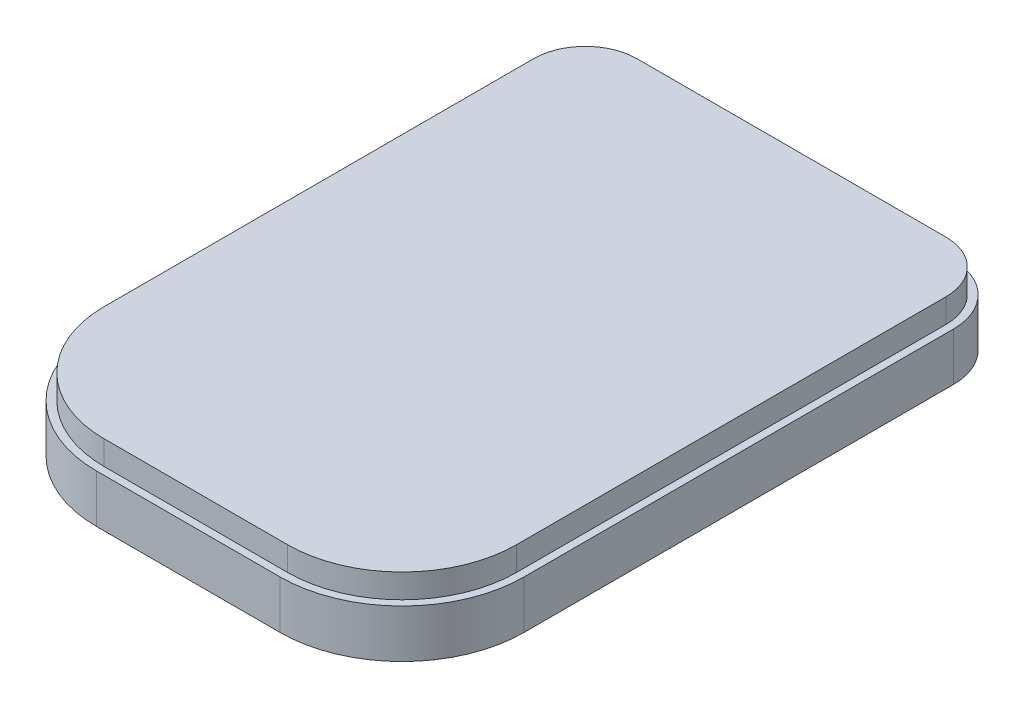
ISO-10303-21;
HEADER;
FILE_DESCRIPTION(('STEP AP214'),'2;1');
FILE_NAME('part.step','',(''),(''),'','','');
FILE_SCHEMA(('AUTOMOTIVE_DESIGN { 1 0 10303 214 1 1 1 1 }'));
ENDSEC;
DATA;
#1=APPLICATION_CONTEXT('core data for automotive mechanical design processes');
#2=APPLICATION_PROTOCOL_DEFINITION('international standard','automotive_design',2000,#1);
#3=PRODUCT_CONTEXT('',#1,'mechanical');
#4=PRODUCT('Part','Part','',(#3));
#5=PRODUCT_RELATED_PRODUCT_CATEGORY('part','',(#4));
#6=PRODUCT_DEFINITION_FORMATION('','',#4);
#7=PRODUCT_DEFINITION_CONTEXT('part definition',#1,'design');
#8=PRODUCT_DEFINITION('design','',#6,#7);
#9=PRODUCT_DEFINITION_SHAPE('','',#8);
#10=(LENGTH_UNIT() NAMED_UNIT(*) SI_UNIT(.MILLI.,.METRE.));
#11=(NAMED_UNIT(*) PLANE_ANGLE_UNIT() SI_UNIT($,.RADIAN.));
#12=(NAMED_UNIT(*) SI_UNIT($,.STERADIAN.) SOLID_ANGLE_UNIT());
#13=UNCERTAINTY_MEASURE_WITH_UNIT(LENGTH_MEASURE(1.E-05),#10,'distance_accuracy_value','');
#14=(GEOMETRIC_REPRESENTATION_CONTEXT(3) GLOBAL_UNCERTAINTY_ASSIGNED_CONTEXT((#13)) GLOBAL_UNIT_ASSIGNED_CONTEXT((#10,
#11,#12)) REPRESENTATION_CONTEXT('',''));
#15=CARTESIAN_POINT('',(0.,0.,0.));
#16=DIRECTION('',(0.,0.,1.));
#17=DIRECTION('',(1.,0.,0.));
#18=AXIS2_PLACEMENT_3D('',#15,#16,#17);
#19=CARTESIAN_POINT('',(32.1126094796714,10.,-51.1626094796714));
#20=DIRECTION('',(0.,-1.,0.));
#21=DIRECTION('',(0.,0.,-1.));
#22=AXIS2_PLACEMENT_3D('',#19,#20,#21);
#23=CYLINDRICAL_SURFACE('',#22,12.3373905203286);
#24=CARTESIAN_POINT('',(32.1126094796714,0.,-51.1626094796714));
#25=DIRECTION('',(0.,1.,0.));
#26=DIRECTION('',(0.,0.,1.));
#27=AXIS2_PLACEMENT_3D('',#24,#25,#26);
#28=CIRCLE('',#27,12.3373905203286);
#29=CARTESIAN_POINT('',(44.45,0.,-51.1626094796714));
#30=VERTEX_POINT('',#29);
#31=CARTESIAN_POINT('',(32.1126094796714,0.,-63.5));
#32=VERTEX_POINT('',#31);
#33=EDGE_CURVE('E175',#30,#32,#28,.T.);
#34=ORIENTED_EDGE('',*,*,#33,.T.);
#35=DIRECTION('',(0.,-1.,0.));
#36=VECTOR('',#35,1.);
#37=CARTESIAN_POINT('',(32.1126094796714,10.,-63.5));
#38=LINE('',#37,#36);
#39=CARTESIAN_POINT('',(32.1126094796714,10.,-63.5));
#40=VERTEX_POINT('',#39);
#41=EDGE_CURVE('E11',#40,#32,#38,.T.);
#42=ORIENTED_EDGE('',*,*,#41,.F.);
#43=CARTESIAN_POINT('',(32.1126094796714,10.,-51.1626094796714));
#44=DIRECTION('',(0.,1.,0.));
#45=DIRECTION('',(0.,0.,1.));
#46=AXIS2_PLACEMENT_3D('',#43,#44,#45);
#47=CIRCLE('',#46,12.3373905203286);
#48=CARTESIAN_POINT('',(44.45,10.,-51.1626094796714));
#49=VERTEX_POINT('',#48);
#50=EDGE_CURVE('E186',#49,#40,#47,.T.);
#51=ORIENTED_EDGE('',*,*,#50,.F.);
#52=DIRECTION('',(0.,-1.,0.));
#53=VECTOR('',#52,1.);
#54=CARTESIAN_POINT('',(44.45,10.,-51.1626094796714));
#55=LINE('',#54,#53);
#56=EDGE_CURVE('E211',#49,#30,#55,.T.);
#57=ORIENTED_EDGE('',*,*,#56,.T.);
#58=EDGE_LOOP('',(#34,#42,#51,#57));
#59=FACE_BOUND('',#58,.T.);
#60=ADVANCED_FACE('F39',(#59),#23,.T.);
#61=CARTESIAN_POINT('',(32.1126094796714,10.,-63.5));
#62=DIRECTION('',(0.,0.,1.));
#63=DIRECTION('',(1.,0.,0.));
#64=AXIS2_PLACEMENT_3D('',#61,#62,#63);
#65=PLANE('',#64);
#66=DIRECTION('',(-1.,0.,0.));
#67=VECTOR('',#66,1.);
#68=CARTESIAN_POINT('',(32.1126094796714,0.,-63.5));
#69=LINE('',#68,#67);
#70=CARTESIAN_POINT('',(-32.1126094796714,0.,-63.5));
#71=VERTEX_POINT('',#70);
#72=EDGE_CURVE('E180',#32,#71,#69,.T.);
#73=ORIENTED_EDGE('',*,*,#72,.T.);
#74=DIRECTION('',(0.,-1.,0.));
#75=VECTOR('',#74,1.);
#76=CARTESIAN_POINT('',(-32.1126094796714,10.,-63.5));
#77=LINE('',#76,#75);
#78=CARTESIAN_POINT('',(-32.1126094796714,10.,-63.5));
#79=VERTEX_POINT('',#78);
#80=EDGE_CURVE('E47',#79,#71,#77,.T.);
#81=ORIENTED_EDGE('',*,*,#80,.F.);
#82=DIRECTION('',(-1.,0.,0.));
#83=VECTOR('',#82,1.);
#84=CARTESIAN_POINT('',(32.1126094796714,10.,-63.5));
#85=LINE('',#84,#83);
#86=EDGE_CURVE('E190',#40,#79,#85,.T.);
#87=ORIENTED_EDGE('',*,*,#86,.F.);
#88=ORIENTED_EDGE('',*,*,#41,.T.);
#89=EDGE_LOOP('',(#73,#81,#87,#88));
#90=FACE_BOUND('',#89,.T.);
#91=ADVANCED_FACE('F283',(#90),#65,.F.);
#92=CARTESIAN_POINT('',(-32.1126094796714,10.,-51.1626094796714));
#93=DIRECTION('',(0.,-1.,0.));
#94=DIRECTION('',(0.,0.,-1.));
#95=AXIS2_PLACEMENT_3D('',#92,#93,#94);
#96=CYLINDRICAL_SURFACE('',#95,12.3373905203286);
#97=CARTESIAN_POINT('',(-32.1126094796714,0.,-51.1626094796714));
#98=DIRECTION('',(0.,1.,0.));
#99=DIRECTION('',(0.,0.,1.));
#100=AXIS2_PLACEMENT_3D('',#97,#98,#99);
#101=CIRCLE('',#100,12.3373905203286);
#102=CARTESIAN_POINT('',(-44.45,0.,-51.1626094796714));
#103=VERTEX_POINT('',#102);
#104=EDGE_CURVE('E215',#71,#103,#101,.T.);
#105=ORIENTED_EDGE('',*,*,#104,.T.);
#106=DIRECTION('',(0.,-1.,0.));
#107=VECTOR('',#106,1.);
#108=CARTESIAN_POINT('',(-44.45,10.,-51.1626094796714));
#109=LINE('',#108,#107);
#110=CARTESIAN_POINT('',(-44.45,10.,-51.1626094796714));
#111=VERTEX_POINT('',#110);
#112=EDGE_CURVE('E251',#111,#103,#109,.T.);
#113=ORIENTED_EDGE('',*,*,#112,.F.);
#114=CARTESIAN_POINT('',(-32.1126094796714,10.,-51.1626094796714));
#115=DIRECTION('',(0.,1.,0.));
#116=DIRECTION('',(0.,0.,1.));
#117=AXIS2_PLACEMENT_3D('',#114,#115,#116);
#118=CIRCLE('',#117,12.3373905203286);
#119=EDGE_CURVE('E194',#79,#111,#118,.T.);
#120=ORIENTED_EDGE('',*,*,#119,.F.);
#121=ORIENTED_EDGE('',*,*,#80,.T.);
#122=EDGE_LOOP('',(#105,#113,#120,#121));
#123=FACE_BOUND('',#122,.T.);
#124=ADVANCED_FACE('F260',(#123),#96,.T.);
#125=CARTESIAN_POINT('',(-44.45,10.,-51.1626094796714));
#126=DIRECTION('',(1.,0.,0.));
#127=DIRECTION('',(0.,0.,-1.));
#128=AXIS2_PLACEMENT_3D('',#125,#126,#127);
#129=PLANE('',#128);
#130=DIRECTION('',(0.,0.,1.));
#131=VECTOR('',#130,1.);
#132=CARTESIAN_POINT('',(-44.45,0.,-51.1626094796714));
#133=LINE('',#132,#131);
#134=CARTESIAN_POINT('',(-44.45,0.,38.1));
#135=VERTEX_POINT('',#134);
#136=EDGE_CURVE('E218',#103,#135,#133,.T.);
#137=ORIENTED_EDGE('',*,*,#136,.T.);
#138=DIRECTION('',(0.,-1.,0.));
#139=VECTOR('',#138,1.);
#140=CARTESIAN_POINT('',(-44.45,10.,38.1));
#141=LINE('',#140,#139);
#142=CARTESIAN_POINT('',(-44.45,10.,38.1));
#143=VERTEX_POINT('',#142);
#144=EDGE_CURVE('E247',#143,#135,#141,.T.);
#145=ORIENTED_EDGE('',*,*,#144,.F.);
#146=DIRECTION('',(0.,0.,1.));
#147=VECTOR('',#146,1.);
#148=CARTESIAN_POINT('',(-44.45,10.,-51.1626094796714));
#149=LINE('',#148,#147);
#150=EDGE_CURVE('E197',#111,#143,#149,.T.);
#151=ORIENTED_EDGE('',*,*,#150,.F.);
#152=ORIENTED_EDGE('',*,*,#112,.T.);
#153=EDGE_LOOP('',(#137,#145,#151,#152));
#154=FACE_BOUND('',#153,.T.);
#155=ADVANCED_FACE('F271',(#154),#129,.F.);
#156=CARTESIAN_POINT('',(-19.05,10.,38.1));
#157=DIRECTION('',(0.,-1.,0.));
#158=DIRECTION('',(0.,0.,-1.));
#159=AXIS2_PLACEMENT_3D('',#156,#157,#158);
#160=CYLINDRICAL_SURFACE('',#159,25.4);
#161=CARTESIAN_POINT('',(-19.05,0.,38.1));
#162=DIRECTION('',(0.,1.,0.));
#163=DIRECTION('',(0.,0.,1.));
#164=AXIS2_PLACEMENT_3D('',#161,#162,#163);
#165=CIRCLE('',#164,25.4);
#166=CARTESIAN_POINT('',(-19.05,0.,63.5));
#167=VERTEX_POINT('',#166);
#168=EDGE_CURVE('E221',#135,#167,#165,.T.);
#169=ORIENTED_EDGE('',*,*,#168,.T.);
#170=DIRECTION('',(0.,-1.,0.));
#171=VECTOR('',#170,1.);
#172=CARTESIAN_POINT('',(-19.05,10.,63.5));
#173=LINE('',#172,#171);
#174=CARTESIAN_POINT('',(-19.05,10.,63.5));
#175=VERTEX_POINT('',#174);
#176=EDGE_CURVE('E243',#175,#167,#173,.T.);
#177=ORIENTED_EDGE('',*,*,#176,.F.);
#178=CARTESIAN_POINT('',(-19.05,10.,38.1));
#179=DIRECTION('',(0.,1.,0.));
#180=DIRECTION('',(0.,0.,1.));
#181=AXIS2_PLACEMENT_3D('',#178,#179,#180);
#182=CIRCLE('',#181,25.4);
#183=EDGE_CURVE('E200',#143,#175,#182,.T.);
#184=ORIENTED_EDGE('',*,*,#183,.F.);
#185=ORIENTED_EDGE('',*,*,#144,.T.);
#186=EDGE_LOOP('',(#169,#177,#184,#185));
#187=FACE_BOUND('',#186,.T.);
#188=ADVANCED_FACE('F275',(#187),#160,.T.);
#189=CARTESIAN_POINT('',(-19.05,10.,63.5));
#190=DIRECTION('',(0.,0.,-1.));
#191=DIRECTION('',(-1.,0.,0.));
#192=AXIS2_PLACEMENT_3D('',#189,#190,#191);
#193=PLANE('',#192);
#194=DIRECTION('',(1.,0.,0.));
#195=VECTOR('',#194,1.);
#196=CARTESIAN_POINT('',(-19.05,0.,63.5));
#197=LINE('',#196,#195);
#198=CARTESIAN_POINT('',(19.05,0.,63.5));
#199=VERTEX_POINT('',#198);
#200=EDGE_CURVE('E224',#167,#199,#197,.T.);
#201=ORIENTED_EDGE('',*,*,#200,.T.);
#202=DIRECTION('',(0.,-1.,0.));
#203=VECTOR('',#202,1.);
#204=CARTESIAN_POINT('',(19.05,10.,63.5));
#205=LINE('',#204,#203);
#206=CARTESIAN_POINT('',(19.05,10.,63.5));
#207=VERTEX_POINT('',#206);
#208=EDGE_CURVE('E239',#207,#199,#205,.T.);
#209=ORIENTED_EDGE('',*,*,#208,.F.);
#210=DIRECTION('',(1.,0.,0.));
#211=VECTOR('',#210,1.);
#212=CARTESIAN_POINT('',(-19.05,10.,63.5));
#213=LINE('',#212,#211);
#214=EDGE_CURVE('E203',#175,#207,#213,.T.);
#215=ORIENTED_EDGE('',*,*,#214,.F.);
#216=ORIENTED_EDGE('',*,*,#176,.T.);
#217=EDGE_LOOP('',(#201,#209,#215,#216));
#218=FACE_BOUND('',#217,.T.);
#219=ADVANCED_FACE('F296',(#218),#193,.F.);
#220=CARTESIAN_POINT('',(19.05,10.,38.1));
#221=DIRECTION('',(0.,-1.,0.));
#222=DIRECTION('',(0.,0.,-1.));
#223=AXIS2_PLACEMENT_3D('',#220,#221,#222);
#224=CYLINDRICAL_SURFACE('',#223,25.4);
#225=CARTESIAN_POINT('',(19.05,0.,38.1));
#226=DIRECTION('',(0.,1.,0.));
#227=DIRECTION('',(0.,0.,1.));
#228=AXIS2_PLACEMENT_3D('',#225,#226,#227);
#229=CIRCLE('',#228,25.4);
#230=CARTESIAN_POINT('',(44.45,0.,38.1));
#231=VERTEX_POINT('',#230);
#232=EDGE_CURVE('E227',#199,#231,#229,.T.);
#233=ORIENTED_EDGE('',*,*,#232,.T.);
#234=DIRECTION('',(0.,-1.,0.));
#235=VECTOR('',#234,1.);
#236=CARTESIAN_POINT('',(44.45,10.,38.1));
#237=LINE('',#236,#235);
#238=CARTESIAN_POINT('',(44.45,10.,38.1));
#239=VERTEX_POINT('',#238);
#240=EDGE_CURVE('E235',#239,#231,#237,.T.);
#241=ORIENTED_EDGE('',*,*,#240,.F.);
#242=CARTESIAN_POINT('',(19.05,10.,38.1));
#243=DIRECTION('',(0.,1.,0.));
#244=DIRECTION('',(0.,0.,1.));
#245=AXIS2_PLACEMENT_3D('',#242,#243,#244);
#246=CIRCLE('',#245,25.4);
#247=EDGE_CURVE('E206',#207,#239,#246,.T.);
#248=ORIENTED_EDGE('',*,*,#247,.F.);
#249=ORIENTED_EDGE('',*,*,#208,.T.);
#250=EDGE_LOOP('',(#233,#241,#248,#249));
#251=FACE_BOUND('',#250,.T.);
#252=ADVANCED_FACE('F294',(#251),#224,.T.);
#253=CARTESIAN_POINT('',(44.45,10.,-51.1626094796714));
#254=DIRECTION('',(-1.,0.,0.));
#255=DIRECTION('',(0.,0.,1.));
#256=AXIS2_PLACEMENT_3D('',#253,#254,#255);
#257=PLANE('',#256);
#258=DIRECTION('',(0.,0.,-1.));
#259=VECTOR('',#258,1.);
#260=CARTESIAN_POINT('',(44.45,0.,-51.1626094796714));
#261=LINE('',#260,#259);
#262=EDGE_CURVE('E191',#231,#30,#261,.T.);
#263=ORIENTED_EDGE('',*,*,#262,.T.);
#264=ORIENTED_EDGE('',*,*,#56,.F.);
#265=DIRECTION('',(0.,0.,-1.));
#266=VECTOR('',#265,1.);
#267=CARTESIAN_POINT('',(44.45,10.,-51.1626094796714));
#268=LINE('',#267,#266);
#269=EDGE_CURVE('E209',#239,#49,#268,.T.);
#270=ORIENTED_EDGE('',*,*,#269,.F.);
#271=ORIENTED_EDGE('',*,*,#240,.T.);
#272=EDGE_LOOP('',(#263,#264,#270,#271));
#273=FACE_BOUND('',#272,.T.);
#274=ADVANCED_FACE('F289',(#273),#257,.F.);
#275=CARTESIAN_POINT('',(32.1126094796714,10.,-51.1626094796714));
#276=DIRECTION('',(0.,1.,0.));
#277=DIRECTION('',(0.,0.,1.));
#278=AXIS2_PLACEMENT_3D('',#275,#276,#277);
#279=PLANE('',#278);
#280=CARTESIAN_POINT('',(-32.1126094796714,10.,-51.1626094796714));
#281=DIRECTION('',(0.,1.,0.));
#282=DIRECTION('',(0.,0.,1.));
#283=AXIS2_PLACEMENT_3D('',#280,#281,#282);
#284=CIRCLE('',#283,10.7498905203286);
#285=CARTESIAN_POINT('',(-32.1126094796714,10.,-61.9125));
#286=VERTEX_POINT('',#285);
#287=CARTESIAN_POINT('',(-42.8625,10.,-51.1626094796714));
#288=VERTEX_POINT('',#287);
#289=EDGE_CURVE('E54',#286,#288,#284,.T.);
#290=ORIENTED_EDGE('',*,*,#289,.F.);
#291=DIRECTION('',(-1.,0.,0.));
#292=VECTOR('',#291,1.);
#293=CARTESIAN_POINT('',(32.1126094796714,10.,-61.9125));
#294=LINE('',#293,#292);
#295=CARTESIAN_POINT('',(32.1126094796714,10.,-61.9125));
#296=VERTEX_POINT('',#295);
#297=EDGE_CURVE('E58',#296,#286,#294,.T.);
#298=ORIENTED_EDGE('',*,*,#297,.F.);
#299=CARTESIAN_POINT('',(32.1126094796714,10.,-51.1626094796714));
#300=DIRECTION('',(0.,1.,0.));
#301=DIRECTION('',(0.,0.,1.));
#302=AXIS2_PLACEMENT_3D('',#299,#300,#301);
#303=CIRCLE('',#302,10.7498905203286);
#304=CARTESIAN_POINT('',(42.8625,10.,-51.1626094796714));
#305=VERTEX_POINT('',#304);
#306=EDGE_CURVE('E450',#305,#296,#303,.T.);
#307=ORIENTED_EDGE('',*,*,#306,.F.);
#308=DIRECTION('',(0.,0.,-1.));
#309=VECTOR('',#308,1.);
#310=CARTESIAN_POINT('',(42.8625,10.,38.1));
#311=LINE('',#310,#309);
#312=CARTESIAN_POINT('',(42.8625,10.,38.1));
#313=VERTEX_POINT('',#312);
#314=EDGE_CURVE('E495',#313,#305,#311,.T.);
#315=ORIENTED_EDGE('',*,*,#314,.F.);
#316=CARTESIAN_POINT('',(19.05,10.,38.1));
#317=DIRECTION('',(0.,1.,0.));
#318=DIRECTION('',(0.,0.,1.));
#319=AXIS2_PLACEMENT_3D('',#316,#317,#318);
#320=CIRCLE('',#319,23.8125);
#321=CARTESIAN_POINT('',(19.05,10.,61.9125));
#322=VERTEX_POINT('',#321);
#323=EDGE_CURVE('E487',#322,#313,#320,.T.);
#324=ORIENTED_EDGE('',*,*,#323,.F.);
#325=DIRECTION('',(1.,0.,0.));
#326=VECTOR('',#325,1.);
#327=CARTESIAN_POINT('',(-19.05,10.,61.9125));
#328=LINE('',#327,#326);
#329=CARTESIAN_POINT('',(-19.05,10.,61.9125));
#330=VERTEX_POINT('',#329);
#331=EDGE_CURVE('E478',#330,#322,#328,.T.);
#332=ORIENTED_EDGE('',*,*,#331,.F.);
#333=CARTESIAN_POINT('',(-19.05,10.,38.1));
#334=DIRECTION('',(0.,1.,0.));
#335=DIRECTION('',(0.,0.,1.));
#336=AXIS2_PLACEMENT_3D('',#333,#334,#335);
#337=CIRCLE('',#336,23.8125);
#338=CARTESIAN_POINT('',(-42.8625,10.,38.1));
#339=VERTEX_POINT('',#338);
#340=EDGE_CURVE('E481',#339,#330,#337,.T.);
#341=ORIENTED_EDGE('',*,*,#340,.F.);
#342=DIRECTION('',(0.,0.,1.));
#343=VECTOR('',#342,1.);
#344=CARTESIAN_POINT('',(-42.8625,10.,-51.1626094796714));
#345=LINE('',#344,#343);
#346=EDGE_CURVE('E483',#288,#339,#345,.T.);
#347=ORIENTED_EDGE('',*,*,#346,.F.);
#348=EDGE_LOOP('',(#290,#298,#307,#315,#324,#332,#341,#347));
#349=FACE_BOUND('',#348,.T.);
#350=ORIENTED_EDGE('',*,*,#50,.T.);
#351=ORIENTED_EDGE('',*,*,#86,.T.);
#352=ORIENTED_EDGE('',*,*,#119,.T.);
#353=ORIENTED_EDGE('',*,*,#150,.T.);
#354=ORIENTED_EDGE('',*,*,#183,.T.);
#355=ORIENTED_EDGE('',*,*,#214,.T.);
#356=ORIENTED_EDGE('',*,*,#247,.T.);
#357=ORIENTED_EDGE('',*,*,#269,.T.);
#358=EDGE_LOOP('',(#350,#351,#352,#353,#354,#355,#356,#357));
#359=FACE_BOUND('',#358,.T.);
#360=ADVANCED_FACE('F279',(#349,#359),#279,.T.);
#361=CARTESIAN_POINT('',(32.1126094796714,0.,-51.1626094796714));
#362=DIRECTION('',(0.,1.,0.));
#363=DIRECTION('',(0.,0.,1.));
#364=AXIS2_PLACEMENT_3D('',#361,#362,#363);
#365=PLANE('',#364);
#366=ORIENTED_EDGE('',*,*,#33,.F.);
#367=ORIENTED_EDGE('',*,*,#262,.F.);
#368=ORIENTED_EDGE('',*,*,#232,.F.);
#369=ORIENTED_EDGE('',*,*,#200,.F.);
#370=ORIENTED_EDGE('',*,*,#168,.F.);
#371=ORIENTED_EDGE('',*,*,#136,.F.);
#372=ORIENTED_EDGE('',*,*,#104,.F.);
#373=ORIENTED_EDGE('',*,*,#72,.F.);
#374=EDGE_LOOP('',(#366,#367,#368,#369,#370,#371,#372,#373));
#375=FACE_BOUND('',#374,.T.);
#376=ADVANCED_FACE('F266',(#375),#365,.F.);
#377=CARTESIAN_POINT('',(-32.1126094796714,15.,-51.1626094796714));
#378=DIRECTION('',(0.,-1.,0.));
#379=DIRECTION('',(0.,0.,-1.));
#380=AXIS2_PLACEMENT_3D('',#377,#378,#379);
#381=CYLINDRICAL_SURFACE('',#380,10.7498905203286);
#382=ORIENTED_EDGE('',*,*,#289,.T.);
#383=DIRECTION('',(0.,-1.,0.));
#384=VECTOR('',#383,1.);
#385=CARTESIAN_POINT('',(-42.8625,15.,-51.1626094796714));
#386=LINE('',#385,#384);
#387=CARTESIAN_POINT('',(-42.8625,15.,-51.1626094796714));
#388=VERTEX_POINT('',#387);
#389=EDGE_CURVE('E155',#388,#288,#386,.T.);
#390=ORIENTED_EDGE('',*,*,#389,.F.);
#391=CARTESIAN_POINT('',(-32.1126094796714,15.,-51.1626094796714));
#392=DIRECTION('',(0.,1.,0.));
#393=DIRECTION('',(0.,0.,1.));
#394=AXIS2_PLACEMENT_3D('',#391,#392,#393);
#395=CIRCLE('',#394,10.7498905203286);
#396=CARTESIAN_POINT('',(-32.1126094796714,15.,-61.9125));
#397=VERTEX_POINT('',#396);
#398=EDGE_CURVE('E162',#397,#388,#395,.T.);
#399=ORIENTED_EDGE('',*,*,#398,.F.);
#400=DIRECTION('',(0.,-1.,0.));
#401=VECTOR('',#400,1.);
#402=CARTESIAN_POINT('',(-32.1126094796714,15.,-61.9125));
#403=LINE('',#402,#401);
#404=EDGE_CURVE('E446',#397,#286,#403,.T.);
#405=ORIENTED_EDGE('',*,*,#404,.T.);
#406=EDGE_LOOP('',(#382,#390,#399,#405));
#407=FACE_BOUND('',#406,.T.);
#408=ADVANCED_FACE('F173',(#407),#381,.T.);
#409=CARTESIAN_POINT('',(-42.8625,15.,-51.1626094796714));
#410=DIRECTION('',(1.,0.,0.));
#411=DIRECTION('',(0.,0.,-1.));
#412=AXIS2_PLACEMENT_3D('',#409,#410,#411);
#413=PLANE('',#412);
#414=ORIENTED_EDGE('',*,*,#346,.T.);
#415=DIRECTION('',(0.,-1.,0.));
#416=VECTOR('',#415,1.);
#417=CARTESIAN_POINT('',(-42.8625,15.,38.1));
#418=LINE('',#417,#416);
#419=CARTESIAN_POINT('',(-42.8625,15.,38.1));
#420=VERTEX_POINT('',#419);
#421=EDGE_CURVE('E157',#420,#339,#418,.T.);
#422=ORIENTED_EDGE('',*,*,#421,.F.);
#423=DIRECTION('',(0.,0.,1.));
#424=VECTOR('',#423,1.);
#425=CARTESIAN_POINT('',(-42.8625,15.,-51.1626094796714));
#426=LINE('',#425,#424);
#427=EDGE_CURVE('E150',#388,#420,#426,.T.);
#428=ORIENTED_EDGE('',*,*,#427,.F.);
#429=ORIENTED_EDGE('',*,*,#389,.T.);
#430=EDGE_LOOP('',(#414,#422,#428,#429));
#431=FACE_BOUND('',#430,.T.);
#432=ADVANCED_FACE('F153',(#431),#413,.F.);
#433=CARTESIAN_POINT('',(-19.05,15.,38.1));
#434=DIRECTION('',(0.,-1.,0.));
#435=DIRECTION('',(0.,0.,-1.));
#436=AXIS2_PLACEMENT_3D('',#433,#434,#435);
#437=CYLINDRICAL_SURFACE('',#436,23.8125);
#438=ORIENTED_EDGE('',*,*,#340,.T.);
#439=DIRECTION('',(0.,-1.,0.));
#440=VECTOR('',#439,1.);
#441=CARTESIAN_POINT('',(-19.05,15.,61.9125));
#442=LINE('',#441,#440);
#443=CARTESIAN_POINT('',(-19.05,15.,61.9125));
#444=VERTEX_POINT('',#443);
#445=EDGE_CURVE('E182',#444,#330,#442,.T.);
#446=ORIENTED_EDGE('',*,*,#445,.F.);
#447=CARTESIAN_POINT('',(-19.05,15.,38.1));
#448=DIRECTION('',(0.,1.,0.));
#449=DIRECTION('',(0.,0.,1.));
#450=AXIS2_PLACEMENT_3D('',#447,#448,#449);
#451=CIRCLE('',#450,23.8125);
#452=EDGE_CURVE('E161',#420,#444,#451,.T.);
#453=ORIENTED_EDGE('',*,*,#452,.F.);
#454=ORIENTED_EDGE('',*,*,#421,.T.);
#455=EDGE_LOOP('',(#438,#446,#453,#454));
#456=FACE_BOUND('',#455,.T.);
#457=ADVANCED_FACE('F374',(#456),#437,.T.);
#458=CARTESIAN_POINT('',(-19.05,15.,61.9125));
#459=DIRECTION('',(0.,0.,-1.));
#460=DIRECTION('',(-1.,0.,0.));
#461=AXIS2_PLACEMENT_3D('',#458,#459,#460);
#462=PLANE('',#461);
#463=ORIENTED_EDGE('',*,*,#331,.T.);
#464=DIRECTION('',(0.,-1.,0.));
#465=VECTOR('',#464,1.);
#466=CARTESIAN_POINT('',(19.05,15.,61.9125));
#467=LINE('',#466,#465);
#468=CARTESIAN_POINT('',(19.05,15.,61.9125));
#469=VERTEX_POINT('',#468);
#470=EDGE_CURVE('E469',#469,#322,#467,.T.);
#471=ORIENTED_EDGE('',*,*,#470,.F.);
#472=DIRECTION('',(1.,0.,0.));
#473=VECTOR('',#472,1.);
#474=CARTESIAN_POINT('',(-19.05,15.,61.9125));
#475=LINE('',#474,#473);
#476=EDGE_CURVE('E479',#444,#469,#475,.T.);
#477=ORIENTED_EDGE('',*,*,#476,.F.);
#478=ORIENTED_EDGE('',*,*,#445,.T.);
#479=EDGE_LOOP('',(#463,#471,#477,#478));
#480=FACE_BOUND('',#479,.T.);
#481=ADVANCED_FACE('F383',(#480),#462,.F.);
#482=CARTESIAN_POINT('',(19.05,15.,38.1));
#483=DIRECTION('',(0.,-1.,0.));
#484=DIRECTION('',(0.,0.,-1.));
#485=AXIS2_PLACEMENT_3D('',#482,#483,#484);
#486=CYLINDRICAL_SURFACE('',#485,23.8125);
#487=ORIENTED_EDGE('',*,*,#323,.T.);
#488=DIRECTION('',(0.,-1.,0.));
#489=VECTOR('',#488,1.);
#490=CARTESIAN_POINT('',(42.8625,15.,38.1));
#491=LINE('',#490,#489);
#492=CARTESIAN_POINT('',(42.8625,15.,38.1));
#493=VERTEX_POINT('',#492);
#494=EDGE_CURVE('E465',#493,#313,#491,.T.);
#495=ORIENTED_EDGE('',*,*,#494,.F.);
#496=CARTESIAN_POINT('',(19.05,15.,38.1));
#497=DIRECTION('',(0.,1.,0.));
#498=DIRECTION('',(0.,0.,1.));
#499=AXIS2_PLACEMENT_3D('',#496,#497,#498);
#500=CIRCLE('',#499,23.8125);
#501=EDGE_CURVE('E505',#469,#493,#500,.T.);
#502=ORIENTED_EDGE('',*,*,#501,.F.);
#503=ORIENTED_EDGE('',*,*,#470,.T.);
#504=EDGE_LOOP('',(#487,#495,#502,#503));
#505=FACE_BOUND('',#504,.T.);
#506=ADVANCED_FACE('F393',(#505),#486,.T.);
#507=CARTESIAN_POINT('',(42.8625,15.,38.1));
#508=DIRECTION('',(-1.,0.,0.));
#509=DIRECTION('',(0.,0.,1.));
#510=AXIS2_PLACEMENT_3D('',#507,#508,#509);
#511=PLANE('',#510);
#512=ORIENTED_EDGE('',*,*,#314,.T.);
#513=DIRECTION('',(0.,-1.,0.));
#514=VECTOR('',#513,1.);
#515=CARTESIAN_POINT('',(42.8625,15.,-51.1626094796714));
#516=LINE('',#515,#514);
#517=CARTESIAN_POINT('',(42.8625,15.,-51.1626094796714));
#518=VERTEX_POINT('',#517);
#519=EDGE_CURVE('E456',#518,#305,#516,.T.);
#520=ORIENTED_EDGE('',*,*,#519,.F.);
#521=DIRECTION('',(0.,0.,-1.));
#522=VECTOR('',#521,1.);
#523=CARTESIAN_POINT('',(42.8625,15.,38.1));
#524=LINE('',#523,#522);
#525=EDGE_CURVE('E503',#493,#518,#524,.T.);
#526=ORIENTED_EDGE('',*,*,#525,.F.);
#527=ORIENTED_EDGE('',*,*,#494,.T.);
#528=EDGE_LOOP('',(#512,#520,#526,#527));
#529=FACE_BOUND('',#528,.T.);
#530=ADVANCED_FACE('F403',(#529),#511,.F.);
#531=CARTESIAN_POINT('',(32.1126094796714,15.,-51.1626094796714));
#532=DIRECTION('',(0.,-1.,0.));
#533=DIRECTION('',(0.,0.,-1.));
#534=AXIS2_PLACEMENT_3D('',#531,#532,#533);
#535=CYLINDRICAL_SURFACE('',#534,10.7498905203286);
#536=ORIENTED_EDGE('',*,*,#306,.T.);
#537=DIRECTION('',(0.,-1.,0.));
#538=VECTOR('',#537,1.);
#539=CARTESIAN_POINT('',(32.1126094796714,15.,-61.9125));
#540=LINE('',#539,#538);
#541=CARTESIAN_POINT('',(32.1126094796714,15.,-61.9125));
#542=VERTEX_POINT('',#541);
#543=EDGE_CURVE('E448',#542,#296,#540,.T.);
#544=ORIENTED_EDGE('',*,*,#543,.F.);
#545=CARTESIAN_POINT('',(32.1126094796714,15.,-51.1626094796714));
#546=DIRECTION('',(0.,1.,0.));
#547=DIRECTION('',(0.,0.,1.));
#548=AXIS2_PLACEMENT_3D('',#545,#546,#547);
#549=CIRCLE('',#548,10.7498905203286);
#550=EDGE_CURVE('E458',#518,#542,#549,.T.);
#551=ORIENTED_EDGE('',*,*,#550,.F.);
#552=ORIENTED_EDGE('',*,*,#519,.T.);
#553=EDGE_LOOP('',(#536,#544,#551,#552));
#554=FACE_BOUND('',#553,.T.);
#555=ADVANCED_FACE('F413',(#554),#535,.T.);
#556=CARTESIAN_POINT('',(32.1126094796714,15.,-61.9125));
#557=DIRECTION('',(0.,0.,1.));
#558=DIRECTION('',(1.,0.,0.));
#559=AXIS2_PLACEMENT_3D('',#556,#557,#558);
#560=PLANE('',#559);
#561=ORIENTED_EDGE('',*,*,#297,.T.);
#562=ORIENTED_EDGE('',*,*,#404,.F.);
#563=DIRECTION('',(-1.,0.,0.));
#564=VECTOR('',#563,1.);
#565=CARTESIAN_POINT('',(32.1126094796714,15.,-61.9125));
#566=LINE('',#565,#564);
#567=EDGE_CURVE('E167',#542,#397,#566,.T.);
#568=ORIENTED_EDGE('',*,*,#567,.F.);
#569=ORIENTED_EDGE('',*,*,#543,.T.);
#570=EDGE_LOOP('',(#561,#562,#568,#569));
#571=FACE_BOUND('',#570,.T.);
#572=ADVANCED_FACE('F423',(#571),#560,.F.);
#573=CARTESIAN_POINT('',(-32.1126094796714,15.,-51.1626094796714));
#574=DIRECTION('',(0.,1.,0.));
#575=DIRECTION('',(0.,0.,1.));
#576=AXIS2_PLACEMENT_3D('',#573,#574,#575);
#577=PLANE('',#576);
#578=ORIENTED_EDGE('',*,*,#398,.T.);
#579=ORIENTED_EDGE('',*,*,#427,.T.);
#580=ORIENTED_EDGE('',*,*,#452,.T.);
#581=ORIENTED_EDGE('',*,*,#476,.T.);
#582=ORIENTED_EDGE('',*,*,#501,.T.);
#583=ORIENTED_EDGE('',*,*,#525,.T.);
#584=ORIENTED_EDGE('',*,*,#550,.T.);
#585=ORIENTED_EDGE('',*,*,#567,.T.);
#586=EDGE_LOOP('',(#578,#579,#580,#581,#582,#583,#584,#585));
#587=FACE_BOUND('',#586,.T.);
#588=ADVANCED_FACE('F165',(#587),#577,.T.);
#589=CLOSED_SHELL('',(#60,#91,#124,#155,#188,#219,#252,#274,#360,#376,#408,#432,#457,#481,#506,
#530,#555,#572,#588));
#590=MANIFOLD_SOLID_BREP('B2',#589);
#591=ADVANCED_BREP_SHAPE_REPRESENTATION('',(#18,#590),#14);
#592=SHAPE_DEFINITION_REPRESENTATION(#9,#591);
ENDSEC;
END-ISO-10303-21;
